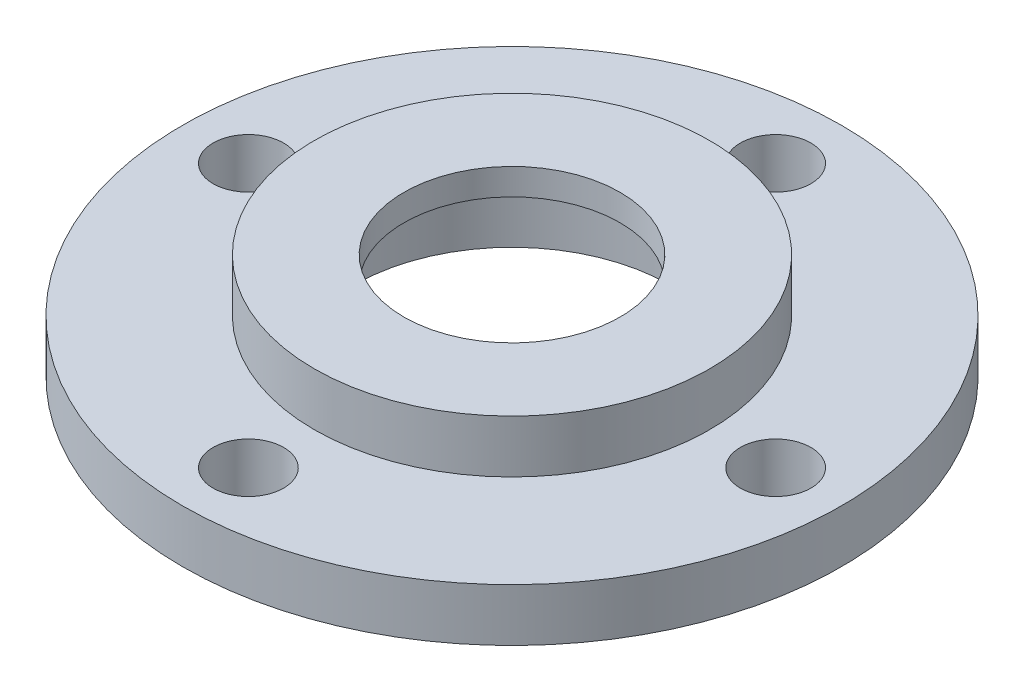
ISO-10303-21;
HEADER;
FILE_DESCRIPTION(('STEP AP214'),'2;1');
FILE_NAME('part.step','',(''),(''),'','','');
FILE_SCHEMA(('AUTOMOTIVE_DESIGN { 1 0 10303 214 1 1 1 1 }'));
ENDSEC;
DATA;
#1=APPLICATION_CONTEXT('core data for automotive mechanical design processes');
#2=APPLICATION_PROTOCOL_DEFINITION('international standard','automotive_design',2000,#1);
#3=PRODUCT_CONTEXT('',#1,'mechanical');
#4=PRODUCT('Part','Part','',(#3));
#5=PRODUCT_RELATED_PRODUCT_CATEGORY('part','',(#4));
#6=PRODUCT_DEFINITION_FORMATION('','',#4);
#7=PRODUCT_DEFINITION_CONTEXT('part definition',#1,'design');
#8=PRODUCT_DEFINITION('design','',#6,#7);
#9=PRODUCT_DEFINITION_SHAPE('','',#8);
#10=(LENGTH_UNIT() NAMED_UNIT(*) SI_UNIT(.MILLI.,.METRE.));
#11=(NAMED_UNIT(*) PLANE_ANGLE_UNIT() SI_UNIT($,.RADIAN.));
#12=(NAMED_UNIT(*) SI_UNIT($,.STERADIAN.) SOLID_ANGLE_UNIT());
#13=UNCERTAINTY_MEASURE_WITH_UNIT(LENGTH_MEASURE(1.E-05),#10,'distance_accuracy_value','');
#14=(GEOMETRIC_REPRESENTATION_CONTEXT(3) GLOBAL_UNCERTAINTY_ASSIGNED_CONTEXT((#13)) GLOBAL_UNIT_ASSIGNED_CONTEXT((#10,
#11,#12)) REPRESENTATION_CONTEXT('',''));
#15=CARTESIAN_POINT('',(0.,0.,0.));
#16=DIRECTION('',(0.,0.,1.));
#17=DIRECTION('',(1.,0.,0.));
#18=AXIS2_PLACEMENT_3D('',#15,#16,#17);
#19=CARTESIAN_POINT('',(0.,2.54,0.));
#20=DIRECTION('',(0.,-1.,0.));
#21=DIRECTION('',(0.,0.,-1.));
#22=AXIS2_PLACEMENT_3D('',#19,#20,#21);
#23=CYLINDRICAL_SURFACE('',#22,15.875);
#24=CARTESIAN_POINT('',(0.,2.54,0.));
#25=DIRECTION('',(0.,1.,0.));
#26=DIRECTION('',(0.,0.,1.));
#27=AXIS2_PLACEMENT_3D('',#24,#25,#26);
#28=CIRCLE('',#27,15.875);
#29=CARTESIAN_POINT('',(0.,2.54,15.875));
#30=VERTEX_POINT('',#29);
#31=EDGE_CURVE('E42',#30,#30,#28,.T.);
#32=ORIENTED_EDGE('',*,*,#31,.F.);
#33=EDGE_LOOP('',(#32));
#34=FACE_BOUND('',#33,.T.);
#35=CARTESIAN_POINT('',(0.,0.,0.));
#36=DIRECTION('',(0.,1.,0.));
#37=DIRECTION('',(0.,0.,1.));
#38=AXIS2_PLACEMENT_3D('',#35,#36,#37);
#39=CIRCLE('',#38,15.875);
#40=CARTESIAN_POINT('',(0.,0.,15.875));
#41=VERTEX_POINT('',#40);
#42=EDGE_CURVE('E38',#41,#41,#39,.T.);
#43=ORIENTED_EDGE('',*,*,#42,.T.);
#44=EDGE_LOOP('',(#43));
#45=FACE_BOUND('',#44,.T.);
#46=ADVANCED_FACE('F35',(#34,#45),#23,.T.);
#47=CARTESIAN_POINT('',(0.,2.54,0.));
#48=DIRECTION('',(0.,1.,0.));
#49=DIRECTION('',(0.,0.,1.));
#50=AXIS2_PLACEMENT_3D('',#47,#48,#49);
#51=PLANE('',#50);
#52=CARTESIAN_POINT('',(0.,2.54,-12.7));
#53=DIRECTION('',(0.,1.,0.));
#54=DIRECTION('',(0.,0.,1.));
#55=AXIS2_PLACEMENT_3D('',#52,#53,#54);
#56=CIRCLE('',#55,1.7);
#57=CARTESIAN_POINT('',(0.,2.54,-11.));
#58=VERTEX_POINT('',#57);
#59=EDGE_CURVE('E80',#58,#58,#56,.T.);
#60=ORIENTED_EDGE('',*,*,#59,.F.);
#61=EDGE_LOOP('',(#60));
#62=FACE_BOUND('',#61,.T.);
#63=CARTESIAN_POINT('',(12.7,2.54,0.));
#64=DIRECTION('',(0.,1.,0.));
#65=DIRECTION('',(0.,0.,1.));
#66=AXIS2_PLACEMENT_3D('',#63,#64,#65);
#67=CIRCLE('',#66,1.70000000000004);
#68=CARTESIAN_POINT('',(12.7,2.54,1.70000000000004));
#69=VERTEX_POINT('',#68);
#70=EDGE_CURVE('E77',#69,#69,#67,.T.);
#71=ORIENTED_EDGE('',*,*,#70,.F.);
#72=EDGE_LOOP('',(#71));
#73=FACE_BOUND('',#72,.T.);
#74=CARTESIAN_POINT('',(0.,2.54,12.7));
#75=DIRECTION('',(0.,1.,0.));
#76=DIRECTION('',(0.,0.,1.));
#77=AXIS2_PLACEMENT_3D('',#74,#75,#76);
#78=CIRCLE('',#77,1.7);
#79=CARTESIAN_POINT('',(0.,2.54,14.4));
#80=VERTEX_POINT('',#79);
#81=EDGE_CURVE('E71',#80,#80,#78,.T.);
#82=ORIENTED_EDGE('',*,*,#81,.F.);
#83=EDGE_LOOP('',(#82));
#84=FACE_BOUND('',#83,.T.);
#85=CARTESIAN_POINT('',(-12.7,2.54,0.));
#86=DIRECTION('',(0.,1.,0.));
#87=DIRECTION('',(0.,0.,1.));
#88=AXIS2_PLACEMENT_3D('',#85,#86,#87);
#89=CIRCLE('',#88,1.7);
#90=CARTESIAN_POINT('',(-12.7,2.54,1.7));
#91=VERTEX_POINT('',#90);
#92=EDGE_CURVE('E64',#91,#91,#89,.T.);
#93=ORIENTED_EDGE('',*,*,#92,.F.);
#94=EDGE_LOOP('',(#93));
#95=FACE_BOUND('',#94,.T.);
#96=CARTESIAN_POINT('',(0.,2.54,0.));
#97=DIRECTION('',(0.,1.,0.));
#98=DIRECTION('',(0.,0.,1.));
#99=AXIS2_PLACEMENT_3D('',#96,#97,#98);
#100=CIRCLE('',#99,9.525);
#101=CARTESIAN_POINT('',(0.,2.54,9.525));
#102=VERTEX_POINT('',#101);
#103=EDGE_CURVE('E10',#102,#102,#100,.T.);
#104=ORIENTED_EDGE('',*,*,#103,.F.);
#105=EDGE_LOOP('',(#104));
#106=FACE_BOUND('',#105,.T.);
#107=ORIENTED_EDGE('',*,*,#31,.T.);
#108=EDGE_LOOP('',(#107));
#109=FACE_BOUND('',#108,.T.);
#110=ADVANCED_FACE('F91',(#62,#73,#84,#95,#106,#109),#51,.T.);
#111=CARTESIAN_POINT('',(0.,0.,0.));
#112=DIRECTION('',(0.,1.,0.));
#113=DIRECTION('',(0.,0.,1.));
#114=AXIS2_PLACEMENT_3D('',#111,#112,#113);
#115=PLANE('',#114);
#116=CARTESIAN_POINT('',(0.,0.,-12.7));
#117=DIRECTION('',(0.,1.,0.));
#118=DIRECTION('',(0.,0.,1.));
#119=AXIS2_PLACEMENT_3D('',#116,#117,#118);
#120=CIRCLE('',#119,1.7);
#121=CARTESIAN_POINT('',(0.,0.,-11.));
#122=VERTEX_POINT('',#121);
#123=EDGE_CURVE('E61',#122,#122,#120,.F.);
#124=ORIENTED_EDGE('',*,*,#123,.F.);
#125=EDGE_LOOP('',(#124));
#126=FACE_BOUND('',#125,.T.);
#127=CARTESIAN_POINT('',(12.7,0.,0.));
#128=DIRECTION('',(0.,1.,0.));
#129=DIRECTION('',(0.,0.,1.));
#130=AXIS2_PLACEMENT_3D('',#127,#128,#129);
#131=CIRCLE('',#130,1.70000000000004);
#132=CARTESIAN_POINT('',(12.7,0.,1.70000000000004));
#133=VERTEX_POINT('',#132);
#134=EDGE_CURVE('E74',#133,#133,#131,.F.);
#135=ORIENTED_EDGE('',*,*,#134,.F.);
#136=EDGE_LOOP('',(#135));
#137=FACE_BOUND('',#136,.T.);
#138=CARTESIAN_POINT('',(0.,0.,12.7));
#139=DIRECTION('',(0.,1.,0.));
#140=DIRECTION('',(0.,0.,1.));
#141=AXIS2_PLACEMENT_3D('',#138,#139,#140);
#142=CIRCLE('',#141,1.7);
#143=CARTESIAN_POINT('',(0.,0.,14.4));
#144=VERTEX_POINT('',#143);
#145=EDGE_CURVE('E67',#144,#144,#142,.F.);
#146=ORIENTED_EDGE('',*,*,#145,.F.);
#147=EDGE_LOOP('',(#146));
#148=FACE_BOUND('',#147,.T.);
#149=CARTESIAN_POINT('',(-12.7,0.,0.));
#150=DIRECTION('',(0.,1.,0.));
#151=DIRECTION('',(0.,0.,1.));
#152=AXIS2_PLACEMENT_3D('',#149,#150,#151);
#153=CIRCLE('',#152,1.7);
#154=CARTESIAN_POINT('',(-12.7,0.,1.7));
#155=VERTEX_POINT('',#154);
#156=EDGE_CURVE('E68',#155,#155,#153,.F.);
#157=ORIENTED_EDGE('',*,*,#156,.F.);
#158=EDGE_LOOP('',(#157));
#159=FACE_BOUND('',#158,.T.);
#160=CARTESIAN_POINT('',(0.,0.,0.));
#161=DIRECTION('',(0.,-1.,0.));
#162=DIRECTION('',(0.,0.,-1.));
#163=AXIS2_PLACEMENT_3D('',#160,#161,#162);
#164=CIRCLE('',#163,7.62);
#165=CARTESIAN_POINT('',(0.,0.,-7.62));
#166=VERTEX_POINT('',#165);
#167=EDGE_CURVE('E52',#166,#166,#164,.T.);
#168=ORIENTED_EDGE('',*,*,#167,.F.);
#169=EDGE_LOOP('',(#168));
#170=FACE_BOUND('',#169,.T.);
#171=ORIENTED_EDGE('',*,*,#42,.F.);
#172=EDGE_LOOP('',(#171));
#173=FACE_BOUND('',#172,.T.);
#174=ADVANCED_FACE('F94',(#126,#137,#148,#159,#170,#173),#115,.F.);
#175=CARTESIAN_POINT('',(0.,5.08,0.));
#176=DIRECTION('',(0.,-1.,0.));
#177=DIRECTION('',(0.,0.,-1.));
#178=AXIS2_PLACEMENT_3D('',#175,#176,#177);
#179=CYLINDRICAL_SURFACE('',#178,9.525);
#180=CARTESIAN_POINT('',(0.,5.08,0.));
#181=DIRECTION('',(0.,1.,0.));
#182=DIRECTION('',(0.,0.,1.));
#183=AXIS2_PLACEMENT_3D('',#180,#181,#182);
#184=CIRCLE('',#183,9.525);
#185=CARTESIAN_POINT('',(0.,5.08,9.525));
#186=VERTEX_POINT('',#185);
#187=EDGE_CURVE('E48',#186,#186,#184,.T.);
#188=ORIENTED_EDGE('',*,*,#187,.F.);
#189=EDGE_LOOP('',(#188));
#190=FACE_BOUND('',#189,.T.);
#191=ORIENTED_EDGE('',*,*,#103,.T.);
#192=EDGE_LOOP('',(#191));
#193=FACE_BOUND('',#192,.T.);
#194=ADVANCED_FACE('F111',(#190,#193),#179,.T.);
#195=CARTESIAN_POINT('',(0.,5.08,0.));
#196=DIRECTION('',(0.,1.,0.));
#197=DIRECTION('',(0.,0.,1.));
#198=AXIS2_PLACEMENT_3D('',#195,#196,#197);
#199=PLANE('',#198);
#200=CARTESIAN_POINT('',(0.,5.08,0.));
#201=DIRECTION('',(0.,1.,0.));
#202=DIRECTION('',(0.,0.,1.));
#203=AXIS2_PLACEMENT_3D('',#200,#201,#202);
#204=CIRCLE('',#203,5.207);
#205=CARTESIAN_POINT('',(0.,5.08,5.207));
#206=VERTEX_POINT('',#205);
#207=EDGE_CURVE('E55',#206,#206,#204,.T.);
#208=ORIENTED_EDGE('',*,*,#207,.F.);
#209=EDGE_LOOP('',(#208));
#210=FACE_BOUND('',#209,.T.);
#211=ORIENTED_EDGE('',*,*,#187,.T.);
#212=EDGE_LOOP('',(#211));
#213=FACE_BOUND('',#212,.T.);
#214=ADVANCED_FACE('F116',(#210,#213),#199,.T.);
#215=CARTESIAN_POINT('',(0.,3.81,0.));
#216=DIRECTION('',(0.,-1.,0.));
#217=DIRECTION('',(0.,0.,-1.));
#218=AXIS2_PLACEMENT_3D('',#215,#216,#217);
#219=CYLINDRICAL_SURFACE('',#218,7.62);
#220=CARTESIAN_POINT('',(0.,3.81,0.));
#221=DIRECTION('',(0.,-1.,0.));
#222=DIRECTION('',(0.,0.,-1.));
#223=AXIS2_PLACEMENT_3D('',#220,#221,#222);
#224=CIRCLE('',#223,7.62);
#225=CARTESIAN_POINT('',(0.,3.81,-7.62));
#226=VERTEX_POINT('',#225);
#227=EDGE_CURVE('E51',#226,#226,#224,.T.);
#228=CARTESIAN_POINT('',(0.,3.81,-7.62));
#229=CARTESIAN_POINT('',(0.,3.7703125,-7.62));
#230=CARTESIAN_POINT('',(0.,3.730625,-7.62));
#231=CARTESIAN_POINT('',(0.,3.65125,-7.62));
#232=CARTESIAN_POINT('',(0.,3.6115625,-7.62));
#233=CARTESIAN_POINT('',(0.,3.5321875,-7.62));
#234=CARTESIAN_POINT('',(0.,3.4925,-7.62));
#235=CARTESIAN_POINT('',(0.,3.413125,-7.62));
#236=CARTESIAN_POINT('',(0.,3.3734375,-7.62));
#237=CARTESIAN_POINT('',(0.,3.2940625,-7.62));
#238=CARTESIAN_POINT('',(0.,3.254375,-7.62));
#239=CARTESIAN_POINT('',(0.,3.175,-7.62));
#240=CARTESIAN_POINT('',(0.,3.1353125,-7.62));
#241=CARTESIAN_POINT('',(0.,3.0559375,-7.62));
#242=CARTESIAN_POINT('',(0.,3.01625,-7.62));
#243=CARTESIAN_POINT('',(0.,2.936875,-7.62));
#244=CARTESIAN_POINT('',(0.,2.8971875,-7.62));
#245=CARTESIAN_POINT('',(0.,2.8178125,-7.62));
#246=CARTESIAN_POINT('',(0.,2.778125,-7.62));
#247=CARTESIAN_POINT('',(0.,2.69875,-7.62));
#248=CARTESIAN_POINT('',(0.,2.6590625,-7.62));
#249=CARTESIAN_POINT('',(0.,2.5796875,-7.62));
#250=CARTESIAN_POINT('',(0.,2.54,-7.62));
#251=CARTESIAN_POINT('',(0.,2.460625,-7.62));
#252=CARTESIAN_POINT('',(0.,2.4209375,-7.62));
#253=CARTESIAN_POINT('',(0.,2.3415625,-7.62));
#254=CARTESIAN_POINT('',(0.,2.301875,-7.62));
#255=CARTESIAN_POINT('',(0.,2.2225,-7.62));
#256=CARTESIAN_POINT('',(0.,2.1828125,-7.62));
#257=CARTESIAN_POINT('',(0.,2.1034375,-7.62));
#258=CARTESIAN_POINT('',(0.,2.06375,-7.62));
#259=CARTESIAN_POINT('',(0.,1.984375,-7.62));
#260=CARTESIAN_POINT('',(0.,1.9446875,-7.62));
#261=CARTESIAN_POINT('',(0.,1.8653125,-7.62));
#262=CARTESIAN_POINT('',(0.,1.825625,-7.62));
#263=CARTESIAN_POINT('',(0.,1.74625,-7.62));
#264=CARTESIAN_POINT('',(0.,1.7065625,-7.62));
#265=CARTESIAN_POINT('',(0.,1.6271875,-7.62));
#266=CARTESIAN_POINT('',(0.,1.5875,-7.62));
#267=CARTESIAN_POINT('',(0.,1.508125,-7.62));
#268=CARTESIAN_POINT('',(0.,1.4684375,-7.62));
#269=CARTESIAN_POINT('',(0.,1.3890625,-7.62));
#270=CARTESIAN_POINT('',(0.,1.349375,-7.62));
#271=CARTESIAN_POINT('',(0.,1.27,-7.62));
#272=CARTESIAN_POINT('',(0.,1.2303125,-7.62));
#273=CARTESIAN_POINT('',(0.,1.1509375,-7.62));
#274=CARTESIAN_POINT('',(0.,1.11125,-7.62));
#275=CARTESIAN_POINT('',(0.,1.031875,-7.62));
#276=CARTESIAN_POINT('',(0.,0.9921875,-7.62));
#277=CARTESIAN_POINT('',(0.,0.9128125,-7.62));
#278=CARTESIAN_POINT('',(0.,0.873125,-7.62));
#279=CARTESIAN_POINT('',(0.,0.79375,-7.62));
#280=CARTESIAN_POINT('',(0.,0.7540625,-7.62));
#281=CARTESIAN_POINT('',(0.,0.6746875,-7.62));
#282=CARTESIAN_POINT('',(0.,0.635,-7.62));
#283=CARTESIAN_POINT('',(0.,0.555625,-7.62));
#284=CARTESIAN_POINT('',(0.,0.5159375,-7.62));
#285=CARTESIAN_POINT('',(0.,0.4365625,-7.62));
#286=CARTESIAN_POINT('',(0.,0.396875,-7.62));
#287=CARTESIAN_POINT('',(0.,0.3175,-7.62));
#288=CARTESIAN_POINT('',(0.,0.2778125,-7.62));
#289=CARTESIAN_POINT('',(0.,0.1984375,-7.62));
#290=CARTESIAN_POINT('',(0.,0.15875,-7.62));
#291=CARTESIAN_POINT('',(0.,0.0793749999999999,-7.62));
#292=CARTESIAN_POINT('',(0.,0.0396874999999999,-7.62));
#293=CARTESIAN_POINT('',(0.,0.,-7.62));
#294=B_SPLINE_CURVE_WITH_KNOTS('',3,(#228,#229,#230,#231,#232,#233,#234,#235,#236,#237,#238,
#239,#240,#241,#242,#243,#244,#245,#246,#247,#248,#249,#250,#251,#252,#253,#254,#255,#256,#257,
#258,#259,#260,#261,#262,#263,#264,#265,#266,#267,#268,#269,#270,#271,#272,#273,#274,#275,#276,
#277,#278,#279,#280,#281,#282,#283,#284,#285,#286,#287,#288,#289,#290,#291,#292,#293),
.UNSPECIFIED.,.F.,.F.,(4,2,2,2,2,2,2,2,2,2,2,2,2,2,2,2,2,2,2,2,2,2,2,2,2,2,2,2,2,2,2,2,4),(0.,
0.1190625,0.238125,0.3571875,0.47625,0.5953125,0.714375,0.8334375,0.9525,1.0715625,1.190625,
1.3096875,1.42875,1.5478125,1.666875,1.7859375,1.905,2.0240625,2.143125,2.2621875,2.38125,
2.5003125,2.619375,2.7384375,2.8575,2.9765625,3.095625,3.2146875,3.33375,3.4528125,3.571875,
3.6909375,3.81),.UNSPECIFIED.);
#295=EDGE_CURVE('BSEAM124',#226,#166,#294,.T.);
#296=ORIENTED_EDGE('',*,*,#227,.F.);
#297=ORIENTED_EDGE('',*,*,#167,.T.);
#298=ORIENTED_EDGE('',*,*,#295,.T.);
#299=ORIENTED_EDGE('',*,*,#295,.F.);
#300=EDGE_LOOP('',(#296,#298,#297,#299));
#301=FACE_BOUND('',#300,.T.);
#302=ADVANCED_FACE('F124',(#301),#219,.F.);
#303=CARTESIAN_POINT('',(0.,3.81,0.));
#304=DIRECTION('',(0.,-1.,0.));
#305=DIRECTION('',(0.,0.,-1.));
#306=AXIS2_PLACEMENT_3D('',#303,#304,#305);
#307=PLANE('',#306);
#308=CARTESIAN_POINT('',(0.,3.81,0.));
#309=DIRECTION('',(0.,-1.,0.));
#310=DIRECTION('',(0.,0.,-1.));
#311=AXIS2_PLACEMENT_3D('',#308,#309,#310);
#312=CIRCLE('',#311,5.207);
#313=CARTESIAN_POINT('',(0.,3.81,-5.207));
#314=VERTEX_POINT('',#313);
#315=EDGE_CURVE('E58',#314,#314,#312,.F.);
#316=ORIENTED_EDGE('',*,*,#315,.T.);
#317=EDGE_LOOP('',(#316));
#318=FACE_BOUND('',#317,.T.);
#319=ORIENTED_EDGE('',*,*,#227,.T.);
#320=EDGE_LOOP('',(#319));
#321=FACE_BOUND('',#320,.T.);
#322=ADVANCED_FACE('F128',(#318,#321),#307,.T.);
#323=CARTESIAN_POINT('',(0.,-0.00100000000000013,0.));
#324=DIRECTION('',(0.,1.,0.));
#325=DIRECTION('',(0.,0.,1.));
#326=AXIS2_PLACEMENT_3D('',#323,#324,#325);
#327=CYLINDRICAL_SURFACE('',#326,5.207);
#328=ORIENTED_EDGE('',*,*,#315,.F.);
#329=EDGE_LOOP('',(#328));
#330=FACE_BOUND('',#329,.T.);
#331=ORIENTED_EDGE('',*,*,#207,.T.);
#332=EDGE_LOOP('',(#331));
#333=FACE_BOUND('',#332,.T.);
#334=ADVANCED_FACE('F132',(#330,#333),#327,.F.);
#335=CARTESIAN_POINT('',(-12.7,-0.00100000000000013,0.));
#336=DIRECTION('',(0.,1.,0.));
#337=DIRECTION('',(0.,0.,1.));
#338=AXIS2_PLACEMENT_3D('',#335,#336,#337);
#339=CYLINDRICAL_SURFACE('',#338,1.7);
#340=ORIENTED_EDGE('',*,*,#92,.T.);
#341=EDGE_LOOP('',(#340));
#342=FACE_BOUND('',#341,.T.);
#343=ORIENTED_EDGE('',*,*,#156,.T.);
#344=EDGE_LOOP('',(#343));
#345=FACE_BOUND('',#344,.T.);
#346=ADVANCED_FACE('F136',(#342,#345),#339,.F.);
#347=CARTESIAN_POINT('',(0.,-0.00100000000000013,12.7));
#348=DIRECTION('',(0.,1.,0.));
#349=DIRECTION('',(0.,0.,1.));
#350=AXIS2_PLACEMENT_3D('',#347,#348,#349);
#351=CYLINDRICAL_SURFACE('',#350,1.7);
#352=ORIENTED_EDGE('',*,*,#81,.T.);
#353=EDGE_LOOP('',(#352));
#354=FACE_BOUND('',#353,.T.);
#355=ORIENTED_EDGE('',*,*,#145,.T.);
#356=EDGE_LOOP('',(#355));
#357=FACE_BOUND('',#356,.T.);
#358=ADVANCED_FACE('F140',(#354,#357),#351,.F.);
#359=CARTESIAN_POINT('',(12.7,-0.00100000000000013,0.));
#360=DIRECTION('',(0.,1.,0.));
#361=DIRECTION('',(0.,0.,1.));
#362=AXIS2_PLACEMENT_3D('',#359,#360,#361);
#363=CYLINDRICAL_SURFACE('',#362,1.70000000000004);
#364=ORIENTED_EDGE('',*,*,#70,.T.);
#365=EDGE_LOOP('',(#364));
#366=FACE_BOUND('',#365,.T.);
#367=ORIENTED_EDGE('',*,*,#134,.T.);
#368=EDGE_LOOP('',(#367));
#369=FACE_BOUND('',#368,.T.);
#370=ADVANCED_FACE('F144',(#366,#369),#363,.F.);
#371=CARTESIAN_POINT('',(0.,-0.00100000000000013,-12.7));
#372=DIRECTION('',(0.,1.,0.));
#373=DIRECTION('',(0.,0.,1.));
#374=AXIS2_PLACEMENT_3D('',#371,#372,#373);
#375=CYLINDRICAL_SURFACE('',#374,1.7);
#376=ORIENTED_EDGE('',*,*,#59,.T.);
#377=EDGE_LOOP('',(#376));
#378=FACE_BOUND('',#377,.T.);
#379=ORIENTED_EDGE('',*,*,#123,.T.);
#380=EDGE_LOOP('',(#379));
#381=FACE_BOUND('',#380,.T.);
#382=ADVANCED_FACE('F88',(#378,#381),#375,.F.);
#383=CLOSED_SHELL('',(#46,#110,#174,#194,#214,#302,#322,#334,#346,#358,#370,#382));
#384=MANIFOLD_SOLID_BREP('B2',#383);
#385=ADVANCED_BREP_SHAPE_REPRESENTATION('',(#18,#384),#14);
#386=SHAPE_DEFINITION_REPRESENTATION(#9,#385);
ENDSEC;
END-ISO-10303-21;
